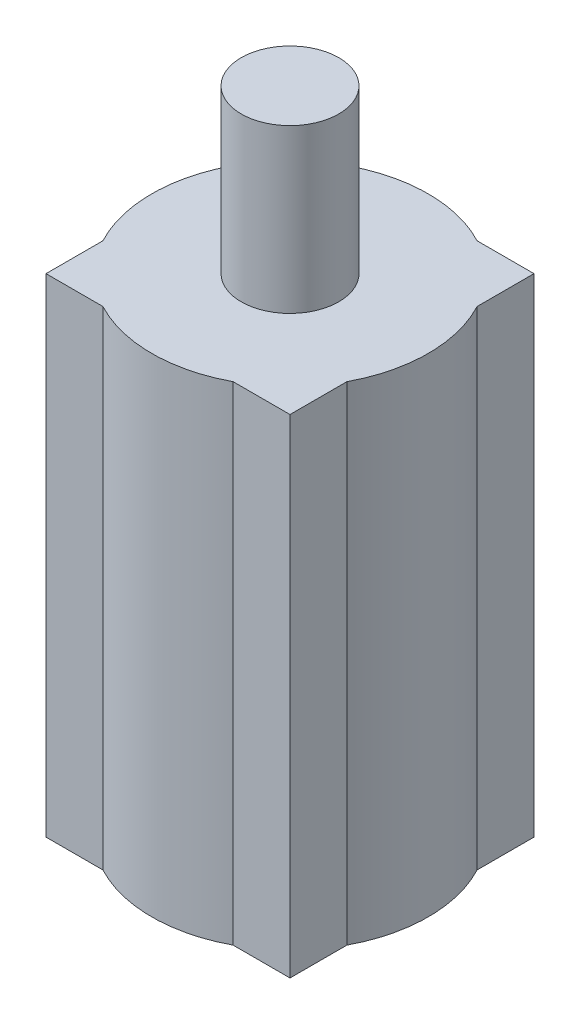
ISO-10303-21;
HEADER;
FILE_DESCRIPTION(('STEP AP214'),'2;1');
FILE_NAME('part.step','',(''),(''),'','','');
FILE_SCHEMA(('AUTOMOTIVE_DESIGN { 1 0 10303 214 1 1 1 1 }'));
ENDSEC;
DATA;
#1=APPLICATION_CONTEXT('core data for automotive mechanical design processes');
#2=APPLICATION_PROTOCOL_DEFINITION('international standard','automotive_design',2000,#1);
#3=PRODUCT_CONTEXT('',#1,'mechanical');
#4=PRODUCT('Part','Part','',(#3));
#5=PRODUCT_RELATED_PRODUCT_CATEGORY('part','',(#4));
#6=PRODUCT_DEFINITION_FORMATION('','',#4);
#7=PRODUCT_DEFINITION_CONTEXT('part definition',#1,'design');
#8=PRODUCT_DEFINITION('design','',#6,#7);
#9=PRODUCT_DEFINITION_SHAPE('','',#8);
#10=(LENGTH_UNIT() NAMED_UNIT(*) SI_UNIT(.MILLI.,.METRE.));
#11=(NAMED_UNIT(*) PLANE_ANGLE_UNIT() SI_UNIT($,.RADIAN.));
#12=(NAMED_UNIT(*) SI_UNIT($,.STERADIAN.) SOLID_ANGLE_UNIT());
#13=UNCERTAINTY_MEASURE_WITH_UNIT(LENGTH_MEASURE(1.E-05),#10,'distance_accuracy_value','');
#14=(GEOMETRIC_REPRESENTATION_CONTEXT(3) GLOBAL_UNCERTAINTY_ASSIGNED_CONTEXT((#13)) GLOBAL_UNIT_ASSIGNED_CONTEXT((#10,
#11,#12)) REPRESENTATION_CONTEXT('',''));
#15=CARTESIAN_POINT('',(0.,0.,0.));
#16=DIRECTION('',(0.,0.,1.));
#17=DIRECTION('',(1.,0.,0.));
#18=AXIS2_PLACEMENT_3D('',#15,#16,#17);
#19=CARTESIAN_POINT('',(0.,30.,0.));
#20=DIRECTION('',(0.,-0.999999999999999,0.));
#21=DIRECTION('',(0.,0.,-1.));
#22=AXIS2_PLACEMENT_3D('',#19,#20,#21);
#23=CYLINDRICAL_SURFACE('',#22,8.5);
#24=CARTESIAN_POINT('',(0.,0.,0.));
#25=DIRECTION('',(0.,0.999999999999999,0.));
#26=DIRECTION('',(0.,0.,1.));
#27=AXIS2_PLACEMENT_3D('',#24,#25,#26);
#28=CIRCLE('',#27,8.5);
#29=CARTESIAN_POINT('',(4.,0.,-7.50000000000006));
#30=VERTEX_POINT('',#29);
#31=CARTESIAN_POINT('',(-3.99999999999967,0.,-7.4999999999994));
#32=VERTEX_POINT('',#31);
#33=EDGE_CURVE('E290',#30,#32,#28,.T.);
#34=ORIENTED_EDGE('',*,*,#33,.T.);
#35=DIRECTION('',(0.,-0.999999999999999,0.));
#36=VECTOR('',#35,1.);
#37=CARTESIAN_POINT('',(-4.,29.9999999999998,-7.4999999999994));
#38=LINE('',#37,#36);
#39=CARTESIAN_POINT('',(-4.,29.9999999999998,-7.4999999999994));
#40=VERTEX_POINT('',#39);
#41=EDGE_CURVE('E98',#40,#32,#38,.T.);
#42=ORIENTED_EDGE('',*,*,#41,.F.);
#43=CARTESIAN_POINT('',(0.,30.,0.));
#44=DIRECTION('',(0.,0.999999999999999,0.));
#45=DIRECTION('',(0.,0.,1.));
#46=AXIS2_PLACEMENT_3D('',#43,#44,#45);
#47=CIRCLE('',#46,8.5);
#48=CARTESIAN_POINT('',(3.99999999999989,29.9999999999998,-7.50000000000006));
#49=VERTEX_POINT('',#48);
#50=EDGE_CURVE('E303',#49,#40,#47,.T.);
#51=ORIENTED_EDGE('',*,*,#50,.F.);
#52=DIRECTION('',(0.,-0.999999999999999,0.));
#53=VECTOR('',#52,1.);
#54=CARTESIAN_POINT('',(3.99999999999989,29.9999999999998,-7.50000000000006));
#55=LINE('',#54,#53);
#56=EDGE_CURVE('E89',#49,#30,#55,.T.);
#57=ORIENTED_EDGE('',*,*,#56,.T.);
#58=EDGE_LOOP('',(#34,#42,#51,#57));
#59=FACE_BOUND('',#58,.T.);
#60=ADVANCED_FACE('F78',(#59),#23,.T.);
#61=CARTESIAN_POINT('',(0.,30.,0.));
#62=DIRECTION('',(0.,0.999999999999999,0.));
#63=DIRECTION('',(0.,0.,1.));
#64=AXIS2_PLACEMENT_3D('',#61,#62,#63);
#65=PLANE('',#64);
#66=CARTESIAN_POINT('',(0.,30.,0.));
#67=DIRECTION('',(0.,0.999999999999999,0.));
#68=DIRECTION('',(0.,0.,1.));
#69=AXIS2_PLACEMENT_3D('',#66,#67,#68);
#70=CIRCLE('',#69,3.);
#71=CARTESIAN_POINT('',(0.,30.,-3.));
#72=VERTEX_POINT('',#71);
#73=EDGE_CURVE('E12',#72,#72,#70,.T.);
#74=ORIENTED_EDGE('',*,*,#73,.F.);
#75=EDGE_LOOP('',(#74));
#76=FACE_BOUND('',#75,.T.);
#77=ORIENTED_EDGE('',*,*,#50,.T.);
#78=DIRECTION('',(0.999999999999999,0.,0.));
#79=VECTOR('',#78,1.);
#80=CARTESIAN_POINT('',(-7.49999999999984,29.9999999999998,-7.4999999999994));
#81=LINE('',#80,#79);
#82=CARTESIAN_POINT('',(-7.49999999999984,29.9999999999998,-7.4999999999994));
#83=VERTEX_POINT('',#82);
#84=EDGE_CURVE('E258',#83,#40,#81,.T.);
#85=ORIENTED_EDGE('',*,*,#84,.F.);
#86=DIRECTION('',(0.,0.,-1.));
#87=VECTOR('',#86,1.);
#88=CARTESIAN_POINT('',(-7.49999999999995,29.9999999999998,7.50000000000073));
#89=LINE('',#88,#87);
#90=CARTESIAN_POINT('',(-7.49999999999995,29.9999999999998,-3.99999999999934));
#91=VERTEX_POINT('',#90);
#92=EDGE_CURVE('E191',#91,#83,#89,.T.);
#93=ORIENTED_EDGE('',*,*,#92,.F.);
#94=CARTESIAN_POINT('',(0.,30.,0.));
#95=DIRECTION('',(0.,0.999999999999999,0.));
#96=DIRECTION('',(0.,0.,1.));
#97=AXIS2_PLACEMENT_3D('',#94,#95,#96);
#98=CIRCLE('',#97,8.5);
#99=CARTESIAN_POINT('',(-7.49999999999995,29.9999999999998,4.00000000000067));
#100=VERTEX_POINT('',#99);
#101=EDGE_CURVE('E294',#91,#100,#98,.T.);
#102=ORIENTED_EDGE('',*,*,#101,.T.);
#103=CARTESIAN_POINT('',(-7.49999999999995,29.9999999999998,7.50000000000073));
#104=VERTEX_POINT('',#103);
#105=EDGE_CURVE('E210',#104,#100,#89,.T.);
#106=ORIENTED_EDGE('',*,*,#105,.F.);
#107=DIRECTION('',(0.999999999999999,0.,0.));
#108=VECTOR('',#107,1.);
#109=CARTESIAN_POINT('',(-7.49999999999995,29.9999999999998,7.50000000000073));
#110=LINE('',#109,#108);
#111=CARTESIAN_POINT('',(-3.99999999999989,29.9999999999998,7.50000000000073));
#112=VERTEX_POINT('',#111);
#113=EDGE_CURVE('E242',#104,#112,#110,.T.);
#114=ORIENTED_EDGE('',*,*,#113,.T.);
#115=CARTESIAN_POINT('',(0.,30.,0.));
#116=DIRECTION('',(0.,0.999999999999999,0.));
#117=DIRECTION('',(0.,0.,1.));
#118=AXIS2_PLACEMENT_3D('',#115,#116,#117);
#119=CIRCLE('',#118,8.5);
#120=CARTESIAN_POINT('',(4.,29.9999999999998,7.50000000000006));
#121=VERTEX_POINT('',#120);
#122=EDGE_CURVE('E281',#112,#121,#119,.T.);
#123=ORIENTED_EDGE('',*,*,#122,.T.);
#124=CARTESIAN_POINT('',(7.49999999999973,29.9999999999998,7.50000000000006));
#125=VERTEX_POINT('',#124);
#126=EDGE_CURVE('E246',#121,#125,#110,.T.);
#127=ORIENTED_EDGE('',*,*,#126,.T.);
#128=DIRECTION('',(0.,0.,-1.));
#129=VECTOR('',#128,1.);
#130=CARTESIAN_POINT('',(7.49999999999973,29.9999999999998,7.50000000000006));
#131=LINE('',#130,#129);
#132=CARTESIAN_POINT('',(7.49999999999973,29.9999999999998,4.));
#133=VERTEX_POINT('',#132);
#134=EDGE_CURVE('E252',#125,#133,#131,.T.);
#135=ORIENTED_EDGE('',*,*,#134,.T.);
#136=CARTESIAN_POINT('',(0.,30.,0.));
#137=DIRECTION('',(0.,0.999999999999999,0.));
#138=DIRECTION('',(0.,0.,1.));
#139=AXIS2_PLACEMENT_3D('',#136,#137,#138);
#140=CIRCLE('',#139,8.5);
#141=CARTESIAN_POINT('',(7.49999999999995,29.9999999999998,-4.));
#142=VERTEX_POINT('',#141);
#143=EDGE_CURVE('E268',#133,#142,#140,.T.);
#144=ORIENTED_EDGE('',*,*,#143,.T.);
#145=CARTESIAN_POINT('',(7.49999999999995,29.9999999999998,-7.50000000000006));
#146=VERTEX_POINT('',#145);
#147=EDGE_CURVE('E257',#142,#146,#131,.T.);
#148=ORIENTED_EDGE('',*,*,#147,.T.);
#149=EDGE_CURVE('E218',#49,#146,#81,.T.);
#150=ORIENTED_EDGE('',*,*,#149,.F.);
#151=EDGE_LOOP('',(#77,#85,#93,#102,#106,#114,#123,#127,#135,#144,#148,#150));
#152=FACE_BOUND('',#151,.T.);
#153=ADVANCED_FACE('F322',(#76,#152),#65,.T.);
#154=CARTESIAN_POINT('',(0.,0.,0.));
#155=DIRECTION('',(0.,0.999999999999999,0.));
#156=DIRECTION('',(0.,0.,1.));
#157=AXIS2_PLACEMENT_3D('',#154,#155,#156);
#158=PLANE('',#157);
#159=ORIENTED_EDGE('',*,*,#33,.F.);
#160=DIRECTION('',(0.999999999999999,0.,0.));
#161=VECTOR('',#160,1.);
#162=CARTESIAN_POINT('',(-7.49999999999973,0.,-7.4999999999994));
#163=LINE('',#162,#161);
#164=CARTESIAN_POINT('',(7.49999999999995,0.,-7.50000000000006));
#165=VERTEX_POINT('',#164);
#166=EDGE_CURVE('E200',#30,#165,#163,.T.);
#167=ORIENTED_EDGE('',*,*,#166,.T.);
#168=DIRECTION('',(0.,0.,-1.));
#169=VECTOR('',#168,1.);
#170=CARTESIAN_POINT('',(7.50000000000006,0.,7.50000000000006));
#171=LINE('',#170,#169);
#172=CARTESIAN_POINT('',(7.49999999999995,0.,-4.));
#173=VERTEX_POINT('',#172);
#174=EDGE_CURVE('E199',#173,#165,#171,.T.);
#175=ORIENTED_EDGE('',*,*,#174,.F.);
#176=CARTESIAN_POINT('',(0.,0.,0.));
#177=DIRECTION('',(0.,0.999999999999999,0.));
#178=DIRECTION('',(0.,0.,1.));
#179=AXIS2_PLACEMENT_3D('',#176,#177,#178);
#180=CIRCLE('',#179,8.5);
#181=CARTESIAN_POINT('',(7.50000000000006,0.,4.));
#182=VERTEX_POINT('',#181);
#183=EDGE_CURVE('E195',#182,#173,#180,.T.);
#184=ORIENTED_EDGE('',*,*,#183,.F.);
#185=CARTESIAN_POINT('',(7.50000000000006,0.,7.50000000000006));
#186=VERTEX_POINT('',#185);
#187=EDGE_CURVE('E206',#186,#182,#171,.T.);
#188=ORIENTED_EDGE('',*,*,#187,.F.);
#189=DIRECTION('',(0.999999999999999,0.,0.));
#190=VECTOR('',#189,1.);
#191=CARTESIAN_POINT('',(-7.49999999999995,0.,7.50000000000073));
#192=LINE('',#191,#190);
#193=CARTESIAN_POINT('',(4.,0.,7.50000000000006));
#194=VERTEX_POINT('',#193);
#195=EDGE_CURVE('E215',#194,#186,#192,.T.);
#196=ORIENTED_EDGE('',*,*,#195,.F.);
#197=CARTESIAN_POINT('',(0.,0.,0.));
#198=DIRECTION('',(0.,0.999999999999999,0.));
#199=DIRECTION('',(0.,0.,1.));
#200=AXIS2_PLACEMENT_3D('',#197,#198,#199);
#201=CIRCLE('',#200,8.5);
#202=CARTESIAN_POINT('',(-3.99999999999967,0.,7.50000000000073));
#203=VERTEX_POINT('',#202);
#204=EDGE_CURVE('E264',#203,#194,#201,.T.);
#205=ORIENTED_EDGE('',*,*,#204,.F.);
#206=CARTESIAN_POINT('',(-7.49999999999995,0.,7.50000000000073));
#207=VERTEX_POINT('',#206);
#208=EDGE_CURVE('E185',#207,#203,#192,.T.);
#209=ORIENTED_EDGE('',*,*,#208,.F.);
#210=DIRECTION('',(0.,0.,-1.));
#211=VECTOR('',#210,1.);
#212=CARTESIAN_POINT('',(-7.49999999999995,0.,7.50000000000073));
#213=LINE('',#212,#211);
#214=CARTESIAN_POINT('',(-7.49999999999995,0.,4.00000000000067));
#215=VERTEX_POINT('',#214);
#216=EDGE_CURVE('E184',#207,#215,#213,.T.);
#217=ORIENTED_EDGE('',*,*,#216,.T.);
#218=CARTESIAN_POINT('',(0.,0.,0.));
#219=DIRECTION('',(0.,0.999999999999999,0.));
#220=DIRECTION('',(0.,0.,1.));
#221=AXIS2_PLACEMENT_3D('',#218,#219,#220);
#222=CIRCLE('',#221,8.5);
#223=CARTESIAN_POINT('',(-7.49999999999984,0.,-3.99999999999934));
#224=VERTEX_POINT('',#223);
#225=EDGE_CURVE('E181',#224,#215,#222,.T.);
#226=ORIENTED_EDGE('',*,*,#225,.F.);
#227=CARTESIAN_POINT('',(-7.49999999999973,0.,-7.4999999999994));
#228=VERTEX_POINT('',#227);
#229=EDGE_CURVE('E173',#224,#228,#213,.T.);
#230=ORIENTED_EDGE('',*,*,#229,.T.);
#231=EDGE_CURVE('E178',#228,#32,#163,.T.);
#232=ORIENTED_EDGE('',*,*,#231,.T.);
#233=EDGE_LOOP('',(#159,#167,#175,#184,#188,#196,#205,#209,#217,#226,#230,#232));
#234=FACE_BOUND('',#233,.T.);
#235=ADVANCED_FACE('F176',(#234),#158,.F.);
#236=CARTESIAN_POINT('',(0.,30.,0.));
#237=DIRECTION('',(0.,-0.999999999999999,0.));
#238=DIRECTION('',(0.,0.,-1.));
#239=AXIS2_PLACEMENT_3D('',#236,#237,#238);
#240=CYLINDRICAL_SURFACE('',#239,8.5);
#241=ORIENTED_EDGE('',*,*,#225,.T.);
#242=DIRECTION('',(0.,-0.999999999999999,0.));
#243=VECTOR('',#242,1.);
#244=CARTESIAN_POINT('',(-7.49999999999995,29.9999999999998,4.00000000000067));
#245=LINE('',#244,#243);
#246=EDGE_CURVE('E291',#100,#215,#245,.T.);
#247=ORIENTED_EDGE('',*,*,#246,.F.);
#248=ORIENTED_EDGE('',*,*,#101,.F.);
#249=DIRECTION('',(0.,-0.999999999999999,0.));
#250=VECTOR('',#249,1.);
#251=CARTESIAN_POINT('',(-7.49999999999995,29.9999999999998,-3.99999999999934));
#252=LINE('',#251,#250);
#253=EDGE_CURVE('E287',#91,#224,#252,.T.);
#254=ORIENTED_EDGE('',*,*,#253,.T.);
#255=EDGE_LOOP('',(#241,#247,#248,#254));
#256=FACE_BOUND('',#255,.T.);
#257=ADVANCED_FACE('F361',(#256),#240,.T.);
#258=CARTESIAN_POINT('',(0.,30.,0.));
#259=DIRECTION('',(0.,-0.999999999999999,0.));
#260=DIRECTION('',(0.,0.,-1.));
#261=AXIS2_PLACEMENT_3D('',#258,#259,#260);
#262=CYLINDRICAL_SURFACE('',#261,8.5);
#263=ORIENTED_EDGE('',*,*,#204,.T.);
#264=DIRECTION('',(0.,-0.999999999999999,0.));
#265=VECTOR('',#264,1.);
#266=CARTESIAN_POINT('',(4.,29.9999999999998,7.50000000000006));
#267=LINE('',#266,#265);
#268=EDGE_CURVE('E278',#121,#194,#267,.T.);
#269=ORIENTED_EDGE('',*,*,#268,.F.);
#270=ORIENTED_EDGE('',*,*,#122,.F.);
#271=DIRECTION('',(0.,-0.999999999999999,0.));
#272=VECTOR('',#271,1.);
#273=CARTESIAN_POINT('',(-3.99999999999989,29.9999999999998,7.50000000000073));
#274=LINE('',#273,#272);
#275=EDGE_CURVE('E275',#112,#203,#274,.T.);
#276=ORIENTED_EDGE('',*,*,#275,.T.);
#277=EDGE_LOOP('',(#263,#269,#270,#276));
#278=FACE_BOUND('',#277,.T.);
#279=ADVANCED_FACE('F356',(#278),#262,.T.);
#280=CARTESIAN_POINT('',(0.,30.,0.));
#281=DIRECTION('',(0.,-0.999999999999999,0.));
#282=DIRECTION('',(0.,0.,-1.));
#283=AXIS2_PLACEMENT_3D('',#280,#281,#282);
#284=CYLINDRICAL_SURFACE('',#283,8.5);
#285=ORIENTED_EDGE('',*,*,#183,.T.);
#286=DIRECTION('',(0.,-0.999999999999999,0.));
#287=VECTOR('',#286,1.);
#288=CARTESIAN_POINT('',(7.49999999999995,29.9999999999998,-4.));
#289=LINE('',#288,#287);
#290=EDGE_CURVE('E265',#142,#173,#289,.T.);
#291=ORIENTED_EDGE('',*,*,#290,.F.);
#292=ORIENTED_EDGE('',*,*,#143,.F.);
#293=DIRECTION('',(0.,-0.999999999999999,0.));
#294=VECTOR('',#293,1.);
#295=CARTESIAN_POINT('',(7.49999999999973,29.9999999999998,4.));
#296=LINE('',#295,#294);
#297=EDGE_CURVE('E261',#133,#182,#296,.T.);
#298=ORIENTED_EDGE('',*,*,#297,.T.);
#299=EDGE_LOOP('',(#285,#291,#292,#298));
#300=FACE_BOUND('',#299,.T.);
#301=ADVANCED_FACE('F334',(#300),#284,.T.);
#302=CARTESIAN_POINT('',(-7.49999999999995,29.9999999999998,7.50000000000073));
#303=DIRECTION('',(-0.999999999999999,0.,0.));
#304=DIRECTION('',(0.,0.,1.));
#305=AXIS2_PLACEMENT_3D('',#302,#303,#304);
#306=PLANE('',#305);
#307=ORIENTED_EDGE('',*,*,#253,.F.);
#308=ORIENTED_EDGE('',*,*,#92,.T.);
#309=DIRECTION('',(0.,-0.999999999999999,0.));
#310=VECTOR('',#309,1.);
#311=CARTESIAN_POINT('',(-7.49999999999984,29.9999999999998,-7.4999999999994));
#312=LINE('',#311,#310);
#313=EDGE_CURVE('E188',#83,#228,#312,.T.);
#314=ORIENTED_EDGE('',*,*,#313,.T.);
#315=ORIENTED_EDGE('',*,*,#229,.F.);
#316=EDGE_LOOP('',(#307,#308,#314,#315));
#317=FACE_BOUND('',#316,.T.);
#318=ADVANCED_FACE('F189',(#317),#306,.T.);
#319=ORIENTED_EDGE('',*,*,#246,.T.);
#320=ORIENTED_EDGE('',*,*,#216,.F.);
#321=DIRECTION('',(0.,-0.999999999999999,0.));
#322=VECTOR('',#321,1.);
#323=CARTESIAN_POINT('',(-7.49999999999995,29.9999999999998,7.50000000000073));
#324=LINE('',#323,#322);
#325=EDGE_CURVE('E166',#104,#207,#324,.T.);
#326=ORIENTED_EDGE('',*,*,#325,.F.);
#327=ORIENTED_EDGE('',*,*,#105,.T.);
#328=EDGE_LOOP('',(#319,#320,#326,#327));
#329=FACE_BOUND('',#328,.T.);
#330=ADVANCED_FACE('F358',(#329),#306,.T.);
#331=CARTESIAN_POINT('',(-7.49999999999995,29.9999999999998,7.50000000000073));
#332=DIRECTION('',(0.,0.,-1.));
#333=DIRECTION('',(-0.999999999999999,0.,0.));
#334=AXIS2_PLACEMENT_3D('',#331,#332,#333);
#335=PLANE('',#334);
#336=ORIENTED_EDGE('',*,*,#208,.T.);
#337=ORIENTED_EDGE('',*,*,#275,.F.);
#338=ORIENTED_EDGE('',*,*,#113,.F.);
#339=ORIENTED_EDGE('',*,*,#325,.T.);
#340=EDGE_LOOP('',(#336,#337,#338,#339));
#341=FACE_BOUND('',#340,.T.);
#342=ADVANCED_FACE('F383',(#341),#335,.F.);
#343=ORIENTED_EDGE('',*,*,#126,.F.);
#344=ORIENTED_EDGE('',*,*,#268,.T.);
#345=ORIENTED_EDGE('',*,*,#195,.T.);
#346=DIRECTION('',(0.,-0.999999999999999,0.));
#347=VECTOR('',#346,1.);
#348=CARTESIAN_POINT('',(7.49999999999973,29.9999999999998,7.50000000000006));
#349=LINE('',#348,#347);
#350=EDGE_CURVE('E221',#125,#186,#349,.T.);
#351=ORIENTED_EDGE('',*,*,#350,.F.);
#352=EDGE_LOOP('',(#343,#344,#345,#351));
#353=FACE_BOUND('',#352,.T.);
#354=ADVANCED_FACE('F340',(#353),#335,.F.);
#355=CARTESIAN_POINT('',(7.49999999999973,29.9999999999998,7.50000000000006));
#356=DIRECTION('',(-0.999999999999999,0.,0.));
#357=DIRECTION('',(0.,0.,1.));
#358=AXIS2_PLACEMENT_3D('',#355,#356,#357);
#359=PLANE('',#358);
#360=ORIENTED_EDGE('',*,*,#187,.T.);
#361=ORIENTED_EDGE('',*,*,#297,.F.);
#362=ORIENTED_EDGE('',*,*,#134,.F.);
#363=ORIENTED_EDGE('',*,*,#350,.T.);
#364=EDGE_LOOP('',(#360,#361,#362,#363));
#365=FACE_BOUND('',#364,.T.);
#366=ADVANCED_FACE('F337',(#365),#359,.F.);
#367=ORIENTED_EDGE('',*,*,#147,.F.);
#368=ORIENTED_EDGE('',*,*,#290,.T.);
#369=ORIENTED_EDGE('',*,*,#174,.T.);
#370=DIRECTION('',(0.,-0.999999999999999,0.));
#371=VECTOR('',#370,1.);
#372=CARTESIAN_POINT('',(7.49999999999995,29.9999999999998,-7.50000000000006));
#373=LINE('',#372,#371);
#374=EDGE_CURVE('E82',#146,#165,#373,.T.);
#375=ORIENTED_EDGE('',*,*,#374,.F.);
#376=EDGE_LOOP('',(#367,#368,#369,#375));
#377=FACE_BOUND('',#376,.T.);
#378=ADVANCED_FACE('F331',(#377),#359,.F.);
#379=CARTESIAN_POINT('',(-7.49999999999984,29.9999999999998,-7.4999999999994));
#380=DIRECTION('',(0.,0.,-1.));
#381=DIRECTION('',(-0.999999999999999,0.,0.));
#382=AXIS2_PLACEMENT_3D('',#379,#380,#381);
#383=PLANE('',#382);
#384=ORIENTED_EDGE('',*,*,#56,.F.);
#385=ORIENTED_EDGE('',*,*,#149,.T.);
#386=ORIENTED_EDGE('',*,*,#374,.T.);
#387=ORIENTED_EDGE('',*,*,#166,.F.);
#388=EDGE_LOOP('',(#384,#385,#386,#387));
#389=FACE_BOUND('',#388,.T.);
#390=ADVANCED_FACE('F80',(#389),#383,.T.);
#391=ORIENTED_EDGE('',*,*,#41,.T.);
#392=ORIENTED_EDGE('',*,*,#231,.F.);
#393=ORIENTED_EDGE('',*,*,#313,.F.);
#394=ORIENTED_EDGE('',*,*,#84,.T.);
#395=EDGE_LOOP('',(#391,#392,#393,#394));
#396=FACE_BOUND('',#395,.T.);
#397=ADVANCED_FACE('F197',(#396),#383,.T.);
#398=CARTESIAN_POINT('',(0.,40.,0.));
#399=DIRECTION('',(0.,-0.999999999999999,0.));
#400=DIRECTION('',(0.,0.,-1.));
#401=AXIS2_PLACEMENT_3D('',#398,#399,#400);
#402=CYLINDRICAL_SURFACE('',#401,3.);
#403=CARTESIAN_POINT('',(0.,40.,0.));
#404=DIRECTION('',(0.,0.999999999999999,0.));
#405=DIRECTION('',(0.,0.,1.));
#406=AXIS2_PLACEMENT_3D('',#403,#404,#405);
#407=CIRCLE('',#406,3.);
#408=CARTESIAN_POINT('',(0.,40.,-3.));
#409=VERTEX_POINT('',#408);
#410=EDGE_CURVE('E208',#409,#409,#407,.T.);
#411=CARTESIAN_POINT('',(0.,40.,-3.));
#412=CARTESIAN_POINT('',(0.,39.8958333333334,-3.));
#413=CARTESIAN_POINT('',(0.,39.7916666666667,-3.));
#414=CARTESIAN_POINT('',(0.,39.5833333333334,-3.));
#415=CARTESIAN_POINT('',(0.,39.4791666666667,-3.));
#416=CARTESIAN_POINT('',(0.,39.2708333333334,-3.));
#417=CARTESIAN_POINT('',(0.,39.1666666666667,-3.));
#418=CARTESIAN_POINT('',(0.,38.9583333333334,-3.));
#419=CARTESIAN_POINT('',(0.,38.8541666666667,-3.));
#420=CARTESIAN_POINT('',(0.,38.6458333333334,-3.));
#421=CARTESIAN_POINT('',(0.,38.5416666666667,-3.));
#422=CARTESIAN_POINT('',(0.,38.3333333333334,-3.));
#423=CARTESIAN_POINT('',(0.,38.2291666666667,-3.));
#424=CARTESIAN_POINT('',(0.,38.0208333333334,-3.));
#425=CARTESIAN_POINT('',(0.,37.9166666666667,-3.));
#426=CARTESIAN_POINT('',(0.,37.7083333333334,-3.));
#427=CARTESIAN_POINT('',(0.,37.6041666666667,-3.));
#428=CARTESIAN_POINT('',(0.,37.3958333333334,-3.));
#429=CARTESIAN_POINT('',(0.,37.2916666666667,-3.));
#430=CARTESIAN_POINT('',(0.,37.0833333333334,-3.));
#431=CARTESIAN_POINT('',(0.,36.9791666666667,-3.));
#432=CARTESIAN_POINT('',(0.,36.7708333333334,-3.));
#433=CARTESIAN_POINT('',(0.,36.6666666666667,-3.));
#434=CARTESIAN_POINT('',(0.,36.4583333333334,-3.));
#435=CARTESIAN_POINT('',(0.,36.3541666666667,-3.));
#436=CARTESIAN_POINT('',(0.,36.1458333333334,-3.));
#437=CARTESIAN_POINT('',(0.,36.0416666666667,-3.));
#438=CARTESIAN_POINT('',(0.,35.8333333333334,-3.));
#439=CARTESIAN_POINT('',(0.,35.7291666666667,-3.));
#440=CARTESIAN_POINT('',(0.,35.5208333333334,-3.));
#441=CARTESIAN_POINT('',(0.,35.4166666666667,-3.));
#442=CARTESIAN_POINT('',(0.,35.2083333333334,-3.));
#443=CARTESIAN_POINT('',(0.,35.1041666666667,-3.));
#444=CARTESIAN_POINT('',(0.,34.8958333333334,-3.));
#445=CARTESIAN_POINT('',(0.,34.7916666666667,-3.));
#446=CARTESIAN_POINT('',(0.,34.5833333333334,-3.));
#447=CARTESIAN_POINT('',(0.,34.4791666666667,-3.));
#448=CARTESIAN_POINT('',(0.,34.2708333333334,-3.));
#449=CARTESIAN_POINT('',(0.,34.1666666666667,-3.));
#450=CARTESIAN_POINT('',(0.,33.9583333333334,-3.));
#451=CARTESIAN_POINT('',(0.,33.8541666666667,-3.));
#452=CARTESIAN_POINT('',(0.,33.6458333333334,-3.));
#453=CARTESIAN_POINT('',(0.,33.5416666666667,-3.));
#454=CARTESIAN_POINT('',(0.,33.3333333333334,-3.));
#455=CARTESIAN_POINT('',(0.,33.2291666666667,-3.));
#456=CARTESIAN_POINT('',(0.,33.0208333333334,-3.));
#457=CARTESIAN_POINT('',(0.,32.9166666666667,-3.));
#458=CARTESIAN_POINT('',(0.,32.7083333333334,-3.));
#459=CARTESIAN_POINT('',(0.,32.6041666666667,-3.));
#460=CARTESIAN_POINT('',(0.,32.3958333333334,-3.));
#461=CARTESIAN_POINT('',(0.,32.2916666666667,-3.));
#462=CARTESIAN_POINT('',(0.,32.0833333333334,-3.));
#463=CARTESIAN_POINT('',(0.,31.9791666666667,-3.));
#464=CARTESIAN_POINT('',(0.,31.7708333333334,-3.));
#465=CARTESIAN_POINT('',(0.,31.6666666666667,-3.));
#466=CARTESIAN_POINT('',(0.,31.4583333333334,-3.));
#467=CARTESIAN_POINT('',(0.,31.3541666666667,-3.));
#468=CARTESIAN_POINT('',(0.,31.1458333333334,-3.));
#469=CARTESIAN_POINT('',(0.,31.0416666666667,-3.));
#470=CARTESIAN_POINT('',(0.,30.8333333333334,-3.));
#471=CARTESIAN_POINT('',(0.,30.7291666666667,-3.));
#472=CARTESIAN_POINT('',(0.,30.5208333333334,-3.));
#473=CARTESIAN_POINT('',(0.,30.4166666666667,-3.));
#474=CARTESIAN_POINT('',(0.,30.2083333333334,-3.));
#475=CARTESIAN_POINT('',(0.,30.1041666666667,-3.));
#476=CARTESIAN_POINT('',(0.,30.,-3.));
#477=B_SPLINE_CURVE_WITH_KNOTS('',3,(#411,#412,#413,#414,#415,#416,#417,#418,#419,#420,#421,
#422,#423,#424,#425,#426,#427,#428,#429,#430,#431,#432,#433,#434,#435,#436,#437,#438,#439,#440,
#441,#442,#443,#444,#445,#446,#447,#448,#449,#450,#451,#452,#453,#454,#455,#456,#457,#458,#459,
#460,#461,#462,#463,#464,#465,#466,#467,#468,#469,#470,#471,#472,#473,#474,#475,#476),
.UNSPECIFIED.,.F.,.F.,(4,2,2,2,2,2,2,2,2,2,2,2,2,2,2,2,2,2,2,2,2,2,2,2,2,2,2,2,2,2,2,2,4),(0.,
0.3125,0.625000000000008,0.937500000000001,1.25000000000001,1.56250000000001,1.87500000000001,
2.1875,2.50000000000001,2.81250000000001,3.12500000000001,3.4375,3.75000000000001,4.0625,
4.37500000000001,4.68750000000001,5.00000000000001,5.3125,5.62500000000001,5.93750000000001,
6.25000000000001,6.56250000000001,6.87500000000001,7.18750000000001,7.50000000000001,
7.81250000000001,8.12500000000001,8.43750000000001,8.75000000000001,9.06250000000001,
9.37500000000002,9.68750000000001,10.),.UNSPECIFIED.);
#478=EDGE_CURVE('BSEAM316',#409,#72,#477,.T.);
#479=ORIENTED_EDGE('',*,*,#410,.F.);
#480=ORIENTED_EDGE('',*,*,#73,.T.);
#481=ORIENTED_EDGE('',*,*,#478,.T.);
#482=ORIENTED_EDGE('',*,*,#478,.F.);
#483=EDGE_LOOP('',(#479,#481,#480,#482));
#484=FACE_BOUND('',#483,.T.);
#485=ADVANCED_FACE('F316',(#484),#402,.T.);
#486=CARTESIAN_POINT('',(0.,40.,0.));
#487=DIRECTION('',(0.,0.999999999999999,0.));
#488=DIRECTION('',(0.,0.,1.));
#489=AXIS2_PLACEMENT_3D('',#486,#487,#488);
#490=PLANE('',#489);
#491=ORIENTED_EDGE('',*,*,#410,.T.);
#492=EDGE_LOOP('',(#491));
#493=FACE_BOUND('',#492,.T.);
#494=ADVANCED_FACE('F314',(#493),#490,.T.);
#495=CLOSED_SHELL('',(#60,#153,#235,#257,#279,#301,#318,#330,#342,#354,#366,#378,#390,#397,#485,#494));
#496=MANIFOLD_SOLID_BREP('B2',#495);
#497=ADVANCED_BREP_SHAPE_REPRESENTATION('',(#18,#496),#14);
#498=SHAPE_DEFINITION_REPRESENTATION(#9,#497);
ENDSEC;
END-ISO-10303-21;
